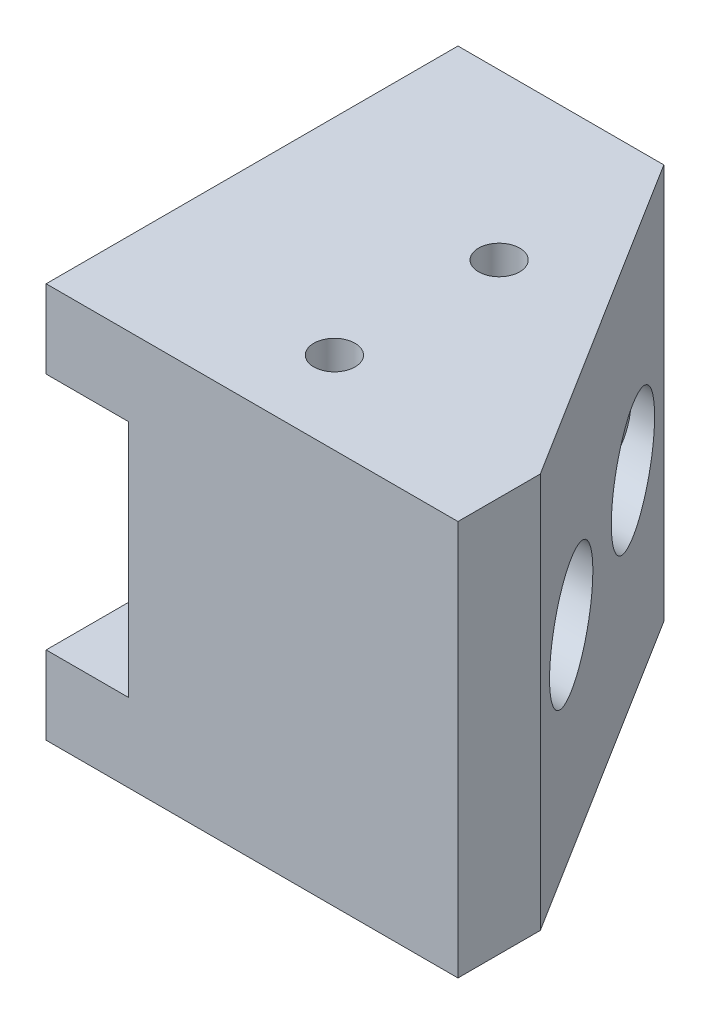
ISO-10303-21;
HEADER;
FILE_DESCRIPTION(('STEP AP214'),'2;1');
FILE_NAME('part.step','',(''),(''),'','','');
FILE_SCHEMA(('AUTOMOTIVE_DESIGN { 1 0 10303 214 1 1 1 1 }'));
ENDSEC;
DATA;
#1=APPLICATION_CONTEXT('core data for automotive mechanical design processes');
#2=APPLICATION_PROTOCOL_DEFINITION('international standard','automotive_design',2000,#1);
#3=PRODUCT_CONTEXT('',#1,'mechanical');
#4=PRODUCT('Part','Part','',(#3));
#5=PRODUCT_RELATED_PRODUCT_CATEGORY('part','',(#4));
#6=PRODUCT_DEFINITION_FORMATION('','',#4);
#7=PRODUCT_DEFINITION_CONTEXT('part definition',#1,'design');
#8=PRODUCT_DEFINITION('design','',#6,#7);
#9=PRODUCT_DEFINITION_SHAPE('','',#8);
#10=(LENGTH_UNIT() NAMED_UNIT(*) SI_UNIT(.MILLI.,.METRE.));
#11=(NAMED_UNIT(*) PLANE_ANGLE_UNIT() SI_UNIT($,.RADIAN.));
#12=(NAMED_UNIT(*) SI_UNIT($,.STERADIAN.) SOLID_ANGLE_UNIT());
#13=UNCERTAINTY_MEASURE_WITH_UNIT(LENGTH_MEASURE(1.E-05),#10,'distance_accuracy_value','');
#14=(GEOMETRIC_REPRESENTATION_CONTEXT(3) GLOBAL_UNCERTAINTY_ASSIGNED_CONTEXT((#13)) GLOBAL_UNIT_ASSIGNED_CONTEXT((#10,
#11,#12)) REPRESENTATION_CONTEXT('',''));
#15=CARTESIAN_POINT('',(0.,0.,0.));
#16=DIRECTION('',(0.,0.,1.));
#17=DIRECTION('',(1.,0.,0.));
#18=AXIS2_PLACEMENT_3D('',#15,#16,#17);
#19=CARTESIAN_POINT('',(0.,0.,2.5));
#20=DIRECTION('',(1.,0.,0.));
#21=DIRECTION('',(0.,0.,-1.));
#22=AXIS2_PLACEMENT_3D('',#19,#20,#21);
#23=CYLINDRICAL_SURFACE('',#22,1.5);
#24=CARTESIAN_POINT('',(5.,0.,2.5));
#25=DIRECTION('',(-1.,0.,0.));
#26=DIRECTION('',(0.,0.,1.));
#27=AXIS2_PLACEMENT_3D('',#24,#25,#26);
#28=CIRCLE('',#27,1.5);
#29=CARTESIAN_POINT('',(5.,0.,4.));
#30=VERTEX_POINT('',#29);
#31=EDGE_CURVE('E136',#30,#30,#28,.T.);
#32=ORIENTED_EDGE('',*,*,#31,.T.);
#33=EDGE_LOOP('',(#32));
#34=FACE_BOUND('',#33,.T.);
#35=CARTESIAN_POINT('',(18.,0.,2.5));
#36=DIRECTION('',(1.,0.,0.));
#37=DIRECTION('',(0.,0.,-1.));
#38=AXIS2_PLACEMENT_3D('',#35,#36,#37);
#39=CIRCLE('',#38,1.5);
#40=CARTESIAN_POINT('',(18.,0.,0.999999999999997));
#41=VERTEX_POINT('',#40);
#42=EDGE_CURVE('E40',#41,#41,#39,.F.);
#43=ORIENTED_EDGE('',*,*,#42,.F.);
#44=EDGE_LOOP('',(#43));
#45=FACE_BOUND('',#44,.T.);
#46=ADVANCED_FACE('F36',(#34,#45),#23,.F.);
#47=CARTESIAN_POINT('',(0.,0.,-7.50000000000001));
#48=DIRECTION('',(1.,0.,0.));
#49=DIRECTION('',(0.,0.,-1.));
#50=AXIS2_PLACEMENT_3D('',#47,#48,#49);
#51=CYLINDRICAL_SURFACE('',#50,1.5);
#52=CARTESIAN_POINT('',(5.,0.,-7.50000000000001));
#53=DIRECTION('',(-1.,0.,0.));
#54=DIRECTION('',(0.,0.,1.));
#55=AXIS2_PLACEMENT_3D('',#52,#53,#54);
#56=CIRCLE('',#55,1.5);
#57=CARTESIAN_POINT('',(5.,0.,-6.00000000000001));
#58=VERTEX_POINT('',#57);
#59=EDGE_CURVE('E133',#58,#58,#56,.T.);
#60=ORIENTED_EDGE('',*,*,#59,.T.);
#61=EDGE_LOOP('',(#60));
#62=FACE_BOUND('',#61,.T.);
#63=CARTESIAN_POINT('',(12.,0.,-7.50000000000001));
#64=DIRECTION('',(1.,0.,0.));
#65=DIRECTION('',(0.,0.,-1.));
#66=AXIS2_PLACEMENT_3D('',#63,#64,#65);
#67=CIRCLE('',#66,1.5);
#68=CARTESIAN_POINT('',(12.,0.,-9.00000000000001));
#69=VERTEX_POINT('',#68);
#70=EDGE_CURVE('E143',#69,#69,#67,.F.);
#71=ORIENTED_EDGE('',*,*,#70,.F.);
#72=EDGE_LOOP('',(#71));
#73=FACE_BOUND('',#72,.T.);
#74=ADVANCED_FACE('F247',(#62,#73),#51,.F.);
#75=CARTESIAN_POINT('',(0.,0.,0.));
#76=DIRECTION('',(1.,0.,0.));
#77=DIRECTION('',(0.,0.,-1.));
#78=AXIS2_PLACEMENT_3D('',#75,#76,#77);
#79=PLANE('',#78);
#80=DIRECTION('',(0.,1.,0.));
#81=VECTOR('',#80,1.);
#82=CARTESIAN_POINT('',(0.,-12.,-12.5));
#83=LINE('',#82,#81);
#84=CARTESIAN_POINT('',(0.,7.25,-12.5));
#85=VERTEX_POINT('',#84);
#86=CARTESIAN_POINT('',(0.,12.,-12.5));
#87=VERTEX_POINT('',#86);
#88=EDGE_CURVE('E204',#85,#87,#83,.T.);
#89=ORIENTED_EDGE('',*,*,#88,.F.);
#90=DIRECTION('',(0.,0.,-1.));
#91=VECTOR('',#90,1.);
#92=CARTESIAN_POINT('',(0.,7.25,12.5));
#93=LINE('',#92,#91);
#94=CARTESIAN_POINT('',(0.,7.25,12.5));
#95=VERTEX_POINT('',#94);
#96=EDGE_CURVE('E172',#95,#85,#93,.T.);
#97=ORIENTED_EDGE('',*,*,#96,.F.);
#98=DIRECTION('',(0.,-1.,0.));
#99=VECTOR('',#98,1.);
#100=CARTESIAN_POINT('',(0.,-12.,12.5));
#101=LINE('',#100,#99);
#102=CARTESIAN_POINT('',(0.,12.,12.5));
#103=VERTEX_POINT('',#102);
#104=EDGE_CURVE('E200',#103,#95,#101,.T.);
#105=ORIENTED_EDGE('',*,*,#104,.F.);
#106=DIRECTION('',(0.,0.,1.));
#107=VECTOR('',#106,1.);
#108=CARTESIAN_POINT('',(0.,12.,-12.5));
#109=LINE('',#108,#107);
#110=EDGE_CURVE('E196',#87,#103,#109,.T.);
#111=ORIENTED_EDGE('',*,*,#110,.F.);
#112=EDGE_LOOP('',(#89,#97,#105,#111));
#113=FACE_BOUND('',#112,.T.);
#114=ADVANCED_FACE('F220',(#113),#79,.F.);
#115=CARTESIAN_POINT('',(25.,-12.,12.5));
#116=DIRECTION('',(0.,0.,-1.));
#117=DIRECTION('',(-1.,0.,0.));
#118=AXIS2_PLACEMENT_3D('',#115,#116,#117);
#119=PLANE('',#118);
#120=ORIENTED_EDGE('',*,*,#104,.T.);
#121=DIRECTION('',(-1.,0.,0.));
#122=VECTOR('',#121,1.);
#123=CARTESIAN_POINT('',(5.,7.25,12.5));
#124=LINE('',#123,#122);
#125=CARTESIAN_POINT('',(5.,7.25,12.5));
#126=VERTEX_POINT('',#125);
#127=EDGE_CURVE('E186',#126,#95,#124,.T.);
#128=ORIENTED_EDGE('',*,*,#127,.F.);
#129=DIRECTION('',(0.,1.,0.));
#130=VECTOR('',#129,1.);
#131=CARTESIAN_POINT('',(5.,-7.25,12.5));
#132=LINE('',#131,#130);
#133=CARTESIAN_POINT('',(5.,-7.25,12.5));
#134=VERTEX_POINT('',#133);
#135=EDGE_CURVE('E175',#134,#126,#132,.T.);
#136=ORIENTED_EDGE('',*,*,#135,.F.);
#137=DIRECTION('',(-1.,0.,0.));
#138=VECTOR('',#137,1.);
#139=CARTESIAN_POINT('',(5.,-7.25,12.5));
#140=LINE('',#139,#138);
#141=CARTESIAN_POINT('',(0.,-7.25,12.5));
#142=VERTEX_POINT('',#141);
#143=EDGE_CURVE('E188',#134,#142,#140,.T.);
#144=ORIENTED_EDGE('',*,*,#143,.T.);
#145=CARTESIAN_POINT('',(0.,-12.,12.5));
#146=VERTEX_POINT('',#145);
#147=EDGE_CURVE('E185',#142,#146,#101,.T.);
#148=ORIENTED_EDGE('',*,*,#147,.T.);
#149=DIRECTION('',(-1.,0.,0.));
#150=VECTOR('',#149,1.);
#151=CARTESIAN_POINT('',(25.,-12.,12.5));
#152=LINE('',#151,#150);
#153=CARTESIAN_POINT('',(25.,-12.,12.5));
#154=VERTEX_POINT('',#153);
#155=EDGE_CURVE('E11',#154,#146,#152,.T.);
#156=ORIENTED_EDGE('',*,*,#155,.F.);
#157=DIRECTION('',(0.,-1.,0.));
#158=VECTOR('',#157,1.);
#159=CARTESIAN_POINT('',(25.,-12.,12.5));
#160=LINE('',#159,#158);
#161=CARTESIAN_POINT('',(25.,12.,12.5));
#162=VERTEX_POINT('',#161);
#163=EDGE_CURVE('E192',#162,#154,#160,.T.);
#164=ORIENTED_EDGE('',*,*,#163,.F.);
#165=DIRECTION('',(-1.,0.,0.));
#166=VECTOR('',#165,1.);
#167=CARTESIAN_POINT('',(25.,12.,12.5));
#168=LINE('',#167,#166);
#169=EDGE_CURVE('E129',#162,#103,#168,.T.);
#170=ORIENTED_EDGE('',*,*,#169,.T.);
#171=EDGE_LOOP('',(#120,#128,#136,#144,#148,#156,#164,#170));
#172=FACE_BOUND('',#171,.T.);
#173=ADVANCED_FACE('F38',(#172),#119,.F.);
#174=CARTESIAN_POINT('',(25.,-12.,-12.5));
#175=DIRECTION('',(0.,1.,0.));
#176=DIRECTION('',(0.,0.,1.));
#177=AXIS2_PLACEMENT_3D('',#174,#175,#176);
#178=PLANE('',#177);
#179=CARTESIAN_POINT('',(12.5,-12.,-2.50000000000001));
#180=DIRECTION('',(0.,1.,0.));
#181=DIRECTION('',(0.,0.,1.));
#182=AXIS2_PLACEMENT_3D('',#179,#180,#181);
#183=CIRCLE('',#182,1.25);
#184=CARTESIAN_POINT('',(12.5,-12.,-1.25000000000001));
#185=VERTEX_POINT('',#184);
#186=EDGE_CURVE('E153',#185,#185,#183,.T.);
#187=ORIENTED_EDGE('',*,*,#186,.T.);
#188=EDGE_LOOP('',(#187));
#189=FACE_BOUND('',#188,.T.);
#190=CARTESIAN_POINT('',(12.5,-12.,7.49999999999999));
#191=DIRECTION('',(0.,1.,0.));
#192=DIRECTION('',(0.,0.,1.));
#193=AXIS2_PLACEMENT_3D('',#190,#191,#192);
#194=CIRCLE('',#193,1.25);
#195=CARTESIAN_POINT('',(12.5,-12.,8.74999999999999));
#196=VERTEX_POINT('',#195);
#197=EDGE_CURVE('E283',#196,#196,#194,.T.);
#198=ORIENTED_EDGE('',*,*,#197,.T.);
#199=EDGE_LOOP('',(#198));
#200=FACE_BOUND('',#199,.T.);
#201=DIRECTION('',(-1.,0.,0.));
#202=VECTOR('',#201,1.);
#203=CARTESIAN_POINT('',(25.,-12.,-12.5));
#204=LINE('',#203,#202);
#205=CARTESIAN_POINT('',(12.5,-12.,-12.5));
#206=VERTEX_POINT('',#205);
#207=CARTESIAN_POINT('',(0.,-12.,-12.5));
#208=VERTEX_POINT('',#207);
#209=EDGE_CURVE('E45',#206,#208,#204,.T.);
#210=ORIENTED_EDGE('',*,*,#209,.F.);
#211=DIRECTION('',(0.52999894000318,0.,0.847998304005088));
#212=VECTOR('',#211,1.);
#213=CARTESIAN_POINT('',(12.5,-12.,-12.5));
#214=LINE('',#213,#212);
#215=CARTESIAN_POINT('',(25.,-12.,7.5));
#216=VERTEX_POINT('',#215);
#217=EDGE_CURVE('E107',#206,#216,#214,.T.);
#218=ORIENTED_EDGE('',*,*,#217,.T.);
#219=DIRECTION('',(0.,0.,-1.));
#220=VECTOR('',#219,1.);
#221=CARTESIAN_POINT('',(25.,-12.,-12.5));
#222=LINE('',#221,#220);
#223=EDGE_CURVE('E195',#154,#216,#222,.T.);
#224=ORIENTED_EDGE('',*,*,#223,.F.);
#225=ORIENTED_EDGE('',*,*,#155,.T.);
#226=DIRECTION('',(0.,0.,-1.));
#227=VECTOR('',#226,1.);
#228=CARTESIAN_POINT('',(0.,-12.,-12.5));
#229=LINE('',#228,#227);
#230=EDGE_CURVE('E126',#146,#208,#229,.T.);
#231=ORIENTED_EDGE('',*,*,#230,.T.);
#232=EDGE_LOOP('',(#210,#218,#224,#225,#231));
#233=FACE_BOUND('',#232,.T.);
#234=ADVANCED_FACE('F124',(#189,#200,#233),#178,.F.);
#235=CARTESIAN_POINT('',(25.,-12.,-12.5));
#236=DIRECTION('',(0.,0.,1.));
#237=DIRECTION('',(1.,0.,0.));
#238=AXIS2_PLACEMENT_3D('',#235,#236,#237);
#239=PLANE('',#238);
#240=DIRECTION('',(-1.,0.,0.));
#241=VECTOR('',#240,1.);
#242=CARTESIAN_POINT('',(25.,12.,-12.5));
#243=LINE('',#242,#241);
#244=CARTESIAN_POINT('',(12.5,12.,-12.5));
#245=VERTEX_POINT('',#244);
#246=EDGE_CURVE('E122',#245,#87,#243,.T.);
#247=ORIENTED_EDGE('',*,*,#246,.F.);
#248=DIRECTION('',(0.,1.,0.));
#249=VECTOR('',#248,1.);
#250=CARTESIAN_POINT('',(12.5,-12.,-12.5));
#251=LINE('',#250,#249);
#252=EDGE_CURVE('E110',#206,#245,#251,.T.);
#253=ORIENTED_EDGE('',*,*,#252,.F.);
#254=ORIENTED_EDGE('',*,*,#209,.T.);
#255=CARTESIAN_POINT('',(0.,-7.25,-12.5));
#256=VERTEX_POINT('',#255);
#257=EDGE_CURVE('E205',#208,#256,#83,.T.);
#258=ORIENTED_EDGE('',*,*,#257,.T.);
#259=DIRECTION('',(-1.,0.,0.));
#260=VECTOR('',#259,1.);
#261=CARTESIAN_POINT('',(5.,-7.25,-12.5));
#262=LINE('',#261,#260);
#263=CARTESIAN_POINT('',(5.,-7.25,-12.5));
#264=VERTEX_POINT('',#263);
#265=EDGE_CURVE('E61',#264,#256,#262,.T.);
#266=ORIENTED_EDGE('',*,*,#265,.F.);
#267=DIRECTION('',(0.,-1.,0.));
#268=VECTOR('',#267,1.);
#269=CARTESIAN_POINT('',(5.,-7.25,-12.5));
#270=LINE('',#269,#268);
#271=CARTESIAN_POINT('',(5.,7.25,-12.5));
#272=VERTEX_POINT('',#271);
#273=EDGE_CURVE('E168',#272,#264,#270,.T.);
#274=ORIENTED_EDGE('',*,*,#273,.F.);
#275=DIRECTION('',(-1.,0.,0.));
#276=VECTOR('',#275,1.);
#277=CARTESIAN_POINT('',(5.,7.25,-12.5));
#278=LINE('',#277,#276);
#279=EDGE_CURVE('E182',#272,#85,#278,.T.);
#280=ORIENTED_EDGE('',*,*,#279,.T.);
#281=ORIENTED_EDGE('',*,*,#88,.T.);
#282=EDGE_LOOP('',(#247,#253,#254,#258,#266,#274,#280,#281));
#283=FACE_BOUND('',#282,.T.);
#284=ADVANCED_FACE('F118',(#283),#239,.F.);
#285=CARTESIAN_POINT('',(25.,12.,-12.5));
#286=DIRECTION('',(0.,-1.,0.));
#287=DIRECTION('',(0.,0.,-1.));
#288=AXIS2_PLACEMENT_3D('',#285,#286,#287);
#289=PLANE('',#288);
#290=CARTESIAN_POINT('',(12.5,12.,-2.5));
#291=DIRECTION('',(0.,1.,0.));
#292=DIRECTION('',(0.,0.,1.));
#293=AXIS2_PLACEMENT_3D('',#290,#291,#292);
#294=CIRCLE('',#293,1.25);
#295=CARTESIAN_POINT('',(12.5,12.,-1.25));
#296=VERTEX_POINT('',#295);
#297=EDGE_CURVE('E158',#296,#296,#294,.T.);
#298=ORIENTED_EDGE('',*,*,#297,.F.);
#299=EDGE_LOOP('',(#298));
#300=FACE_BOUND('',#299,.T.);
#301=CARTESIAN_POINT('',(12.5,12.,7.5));
#302=DIRECTION('',(0.,1.,0.));
#303=DIRECTION('',(0.,0.,1.));
#304=AXIS2_PLACEMENT_3D('',#301,#302,#303);
#305=CIRCLE('',#304,1.25);
#306=CARTESIAN_POINT('',(12.5,12.,8.75));
#307=VERTEX_POINT('',#306);
#308=EDGE_CURVE('E162',#307,#307,#305,.T.);
#309=ORIENTED_EDGE('',*,*,#308,.F.);
#310=EDGE_LOOP('',(#309));
#311=FACE_BOUND('',#310,.T.);
#312=DIRECTION('',(0.,0.,1.));
#313=VECTOR('',#312,1.);
#314=CARTESIAN_POINT('',(25.,12.,-12.5));
#315=LINE('',#314,#313);
#316=CARTESIAN_POINT('',(25.,12.,7.5));
#317=VERTEX_POINT('',#316);
#318=EDGE_CURVE('E198',#317,#162,#315,.T.);
#319=ORIENTED_EDGE('',*,*,#318,.F.);
#320=DIRECTION('',(0.52999894000318,0.,0.847998304005088));
#321=VECTOR('',#320,1.);
#322=CARTESIAN_POINT('',(12.5,12.,-12.5));
#323=LINE('',#322,#321);
#324=EDGE_CURVE('E53',#245,#317,#323,.T.);
#325=ORIENTED_EDGE('',*,*,#324,.F.);
#326=ORIENTED_EDGE('',*,*,#246,.T.);
#327=ORIENTED_EDGE('',*,*,#110,.T.);
#328=ORIENTED_EDGE('',*,*,#169,.F.);
#329=EDGE_LOOP('',(#319,#325,#326,#327,#328));
#330=FACE_BOUND('',#329,.T.);
#331=ADVANCED_FACE('F233',(#300,#311,#330),#289,.F.);
#332=CARTESIAN_POINT('',(25.,0.,0.));
#333=DIRECTION('',(1.,0.,0.));
#334=DIRECTION('',(0.,0.,-1.));
#335=AXIS2_PLACEMENT_3D('',#332,#333,#334);
#336=PLANE('',#335);
#337=DIRECTION('',(0.,1.,0.));
#338=VECTOR('',#337,1.);
#339=CARTESIAN_POINT('',(25.,-12.,7.5));
#340=LINE('',#339,#338);
#341=EDGE_CURVE('E111',#216,#317,#340,.T.);
#342=ORIENTED_EDGE('',*,*,#341,.T.);
#343=ORIENTED_EDGE('',*,*,#318,.T.);
#344=ORIENTED_EDGE('',*,*,#163,.T.);
#345=ORIENTED_EDGE('',*,*,#223,.T.);
#346=EDGE_LOOP('',(#342,#343,#344,#345));
#347=FACE_BOUND('',#346,.T.);
#348=ADVANCED_FACE('F232',(#347),#336,.T.);
#349=ORIENTED_EDGE('',*,*,#147,.F.);
#350=DIRECTION('',(0.,0.,1.));
#351=VECTOR('',#350,1.);
#352=CARTESIAN_POINT('',(0.,-7.25,12.5));
#353=LINE('',#352,#351);
#354=EDGE_CURVE('E139',#256,#142,#353,.T.);
#355=ORIENTED_EDGE('',*,*,#354,.F.);
#356=ORIENTED_EDGE('',*,*,#257,.F.);
#357=ORIENTED_EDGE('',*,*,#230,.F.);
#358=EDGE_LOOP('',(#349,#355,#356,#357));
#359=FACE_BOUND('',#358,.T.);
#360=ADVANCED_FACE('F230',(#359),#79,.F.);
#361=CARTESIAN_POINT('',(5.,7.25,12.5));
#362=DIRECTION('',(0.,1.,0.));
#363=DIRECTION('',(0.,0.,1.));
#364=AXIS2_PLACEMENT_3D('',#361,#362,#363);
#365=PLANE('',#364);
#366=ORIENTED_EDGE('',*,*,#96,.T.);
#367=ORIENTED_EDGE('',*,*,#279,.F.);
#368=DIRECTION('',(0.,0.,-1.));
#369=VECTOR('',#368,1.);
#370=CARTESIAN_POINT('',(5.,7.25,12.5));
#371=LINE('',#370,#369);
#372=EDGE_CURVE('E177',#126,#272,#371,.T.);
#373=ORIENTED_EDGE('',*,*,#372,.F.);
#374=ORIENTED_EDGE('',*,*,#127,.T.);
#375=EDGE_LOOP('',(#366,#367,#373,#374));
#376=FACE_BOUND('',#375,.T.);
#377=ADVANCED_FACE('F222',(#376),#365,.F.);
#378=CARTESIAN_POINT('',(5.,-7.25,12.5));
#379=DIRECTION('',(0.,-1.,0.));
#380=DIRECTION('',(0.,0.,-1.));
#381=AXIS2_PLACEMENT_3D('',#378,#379,#380);
#382=PLANE('',#381);
#383=ORIENTED_EDGE('',*,*,#354,.T.);
#384=ORIENTED_EDGE('',*,*,#143,.F.);
#385=DIRECTION('',(0.,0.,1.));
#386=VECTOR('',#385,1.);
#387=CARTESIAN_POINT('',(5.,-7.25,12.5));
#388=LINE('',#387,#386);
#389=EDGE_CURVE('E171',#264,#134,#388,.T.);
#390=ORIENTED_EDGE('',*,*,#389,.F.);
#391=ORIENTED_EDGE('',*,*,#265,.T.);
#392=EDGE_LOOP('',(#383,#384,#390,#391));
#393=FACE_BOUND('',#392,.T.);
#394=ADVANCED_FACE('F261',(#393),#382,.F.);
#395=CARTESIAN_POINT('',(5.,0.,0.));
#396=DIRECTION('',(-1.,0.,0.));
#397=DIRECTION('',(0.,0.,1.));
#398=AXIS2_PLACEMENT_3D('',#395,#396,#397);
#399=PLANE('',#398);
#400=ORIENTED_EDGE('',*,*,#31,.F.);
#401=EDGE_LOOP('',(#400));
#402=FACE_BOUND('',#401,.T.);
#403=ORIENTED_EDGE('',*,*,#59,.F.);
#404=EDGE_LOOP('',(#403));
#405=FACE_BOUND('',#404,.T.);
#406=ORIENTED_EDGE('',*,*,#273,.T.);
#407=ORIENTED_EDGE('',*,*,#389,.T.);
#408=ORIENTED_EDGE('',*,*,#135,.T.);
#409=ORIENTED_EDGE('',*,*,#372,.T.);
#410=EDGE_LOOP('',(#406,#407,#408,#409));
#411=FACE_BOUND('',#410,.T.);
#412=ADVANCED_FACE('F226',(#402,#405,#411),#399,.T.);
#413=CARTESIAN_POINT('',(12.5,-12.,-12.5));
#414=DIRECTION('',(-0.847998304005088,0.,0.52999894000318));
#415=DIRECTION('',(0.52999894000318,0.,0.847998304005088));
#416=AXIS2_PLACEMENT_3D('',#413,#414,#415);
#417=PLANE('',#416);
#418=CARTESIAN_POINT('',(21.875,0.,2.5));
#419=DIRECTION('',(-0.847998304005088,0.,0.52999894000318));
#420=DIRECTION('',(0.52999894000318,0.,0.847998304005088));
#421=AXIS2_PLACEMENT_3D('',#418,#419,#420);
#422=ELLIPSE('',#421,4.12736674527476,3.5);
#423=CARTESIAN_POINT('',(24.0625,0.,6.));
#424=VERTEX_POINT('',#423);
#425=EDGE_CURVE('E146',#424,#424,#422,.T.);
#426=ORIENTED_EDGE('',*,*,#425,.T.);
#427=EDGE_LOOP('',(#426));
#428=FACE_BOUND('',#427,.T.);
#429=CARTESIAN_POINT('',(15.625,0.,-7.50000000000001));
#430=DIRECTION('',(-0.847998304005088,0.,0.52999894000318));
#431=DIRECTION('',(0.52999894000318,0.,0.847998304005088));
#432=AXIS2_PLACEMENT_3D('',#429,#430,#431);
#433=ELLIPSE('',#432,4.12736674527477,3.5);
#434=CARTESIAN_POINT('',(17.8125,0.,-4.));
#435=VERTEX_POINT('',#434);
#436=EDGE_CURVE('E140',#435,#435,#433,.T.);
#437=ORIENTED_EDGE('',*,*,#436,.T.);
#438=EDGE_LOOP('',(#437));
#439=FACE_BOUND('',#438,.T.);
#440=ORIENTED_EDGE('',*,*,#324,.T.);
#441=ORIENTED_EDGE('',*,*,#341,.F.);
#442=ORIENTED_EDGE('',*,*,#217,.F.);
#443=ORIENTED_EDGE('',*,*,#252,.T.);
#444=EDGE_LOOP('',(#440,#441,#442,#443));
#445=FACE_BOUND('',#444,.T.);
#446=ADVANCED_FACE('F109',(#428,#439,#445),#417,.F.);
#447=CARTESIAN_POINT('',(12.,0.,-7.50000000000001));
#448=DIRECTION('',(1.,0.,0.));
#449=DIRECTION('',(0.,0.,-1.));
#450=AXIS2_PLACEMENT_3D('',#447,#448,#449);
#451=PLANE('',#450);
#452=CARTESIAN_POINT('',(12.,0.,-7.50000000000001));
#453=DIRECTION('',(1.,0.,0.));
#454=DIRECTION('',(0.,0.,-1.));
#455=AXIS2_PLACEMENT_3D('',#452,#453,#454);
#456=CIRCLE('',#455,3.5);
#457=CARTESIAN_POINT('',(12.,0.,-11.));
#458=VERTEX_POINT('',#457);
#459=EDGE_CURVE('E144',#458,#458,#456,.T.);
#460=ORIENTED_EDGE('',*,*,#459,.T.);
#461=EDGE_LOOP('',(#460));
#462=FACE_BOUND('',#461,.T.);
#463=ORIENTED_EDGE('',*,*,#70,.T.);
#464=EDGE_LOOP('',(#463));
#465=FACE_BOUND('',#464,.T.);
#466=ADVANCED_FACE('F308',(#462,#465),#451,.T.);
#467=CARTESIAN_POINT('',(12.,0.,-7.50000000000001));
#468=DIRECTION('',(1.,0.,0.));
#469=DIRECTION('',(0.,0.,-1.));
#470=AXIS2_PLACEMENT_3D('',#467,#468,#469);
#471=CYLINDRICAL_SURFACE('',#470,3.5);
#472=ORIENTED_EDGE('',*,*,#459,.F.);
#473=EDGE_LOOP('',(#472));
#474=FACE_BOUND('',#473,.T.);
#475=ORIENTED_EDGE('',*,*,#436,.F.);
#476=EDGE_LOOP('',(#475));
#477=FACE_BOUND('',#476,.T.);
#478=ADVANCED_FACE('F306',(#474,#477),#471,.F.);
#479=CARTESIAN_POINT('',(18.,0.,2.5));
#480=DIRECTION('',(1.,0.,0.));
#481=DIRECTION('',(0.,0.,-1.));
#482=AXIS2_PLACEMENT_3D('',#479,#480,#481);
#483=PLANE('',#482);
#484=CARTESIAN_POINT('',(18.,0.,2.5));
#485=DIRECTION('',(1.,0.,0.));
#486=DIRECTION('',(0.,0.,-1.));
#487=AXIS2_PLACEMENT_3D('',#484,#485,#486);
#488=CIRCLE('',#487,3.5);
#489=CARTESIAN_POINT('',(18.,0.,-1.));
#490=VERTEX_POINT('',#489);
#491=EDGE_CURVE('E148',#490,#490,#488,.T.);
#492=ORIENTED_EDGE('',*,*,#491,.T.);
#493=EDGE_LOOP('',(#492));
#494=FACE_BOUND('',#493,.T.);
#495=ORIENTED_EDGE('',*,*,#42,.T.);
#496=EDGE_LOOP('',(#495));
#497=FACE_BOUND('',#496,.T.);
#498=ADVANCED_FACE('F301',(#494,#497),#483,.T.);
#499=CARTESIAN_POINT('',(18.,0.,2.5));
#500=DIRECTION('',(1.,0.,0.));
#501=DIRECTION('',(0.,0.,-1.));
#502=AXIS2_PLACEMENT_3D('',#499,#500,#501);
#503=CYLINDRICAL_SURFACE('',#502,3.5);
#504=ORIENTED_EDGE('',*,*,#491,.F.);
#505=EDGE_LOOP('',(#504));
#506=FACE_BOUND('',#505,.T.);
#507=ORIENTED_EDGE('',*,*,#425,.F.);
#508=EDGE_LOOP('',(#507));
#509=FACE_BOUND('',#508,.T.);
#510=ADVANCED_FACE('F293',(#506,#509),#503,.F.);
#511=CARTESIAN_POINT('',(12.5,-12.,7.49999999999999));
#512=DIRECTION('',(0.,1.,0.));
#513=DIRECTION('',(0.,0.,1.));
#514=AXIS2_PLACEMENT_3D('',#511,#512,#513);
#515=CYLINDRICAL_SURFACE('',#514,1.25);
#516=ORIENTED_EDGE('',*,*,#197,.F.);
#517=EDGE_LOOP('',(#516));
#518=FACE_BOUND('',#517,.T.);
#519=ORIENTED_EDGE('',*,*,#308,.T.);
#520=EDGE_LOOP('',(#519));
#521=FACE_BOUND('',#520,.T.);
#522=ADVANCED_FACE('F290',(#518,#521),#515,.F.);
#523=CARTESIAN_POINT('',(12.5,-12.,-2.50000000000001));
#524=DIRECTION('',(0.,1.,0.));
#525=DIRECTION('',(0.,0.,1.));
#526=AXIS2_PLACEMENT_3D('',#523,#524,#525);
#527=CYLINDRICAL_SURFACE('',#526,1.25);
#528=ORIENTED_EDGE('',*,*,#186,.F.);
#529=EDGE_LOOP('',(#528));
#530=FACE_BOUND('',#529,.T.);
#531=ORIENTED_EDGE('',*,*,#297,.T.);
#532=EDGE_LOOP('',(#531));
#533=FACE_BOUND('',#532,.T.);
#534=ADVANCED_FACE('F292',(#530,#533),#527,.F.);
#535=CLOSED_SHELL('',(#46,#74,#114,#173,#234,#284,#331,#348,#360,#377,#394,#412,#446,#466,#478,
#498,#510,#522,#534));
#536=MANIFOLD_SOLID_BREP('B2',#535);
#537=ADVANCED_BREP_SHAPE_REPRESENTATION('',(#18,#536),#14);
#538=SHAPE_DEFINITION_REPRESENTATION(#9,#537);
ENDSEC;
END-ISO-10303-21;
